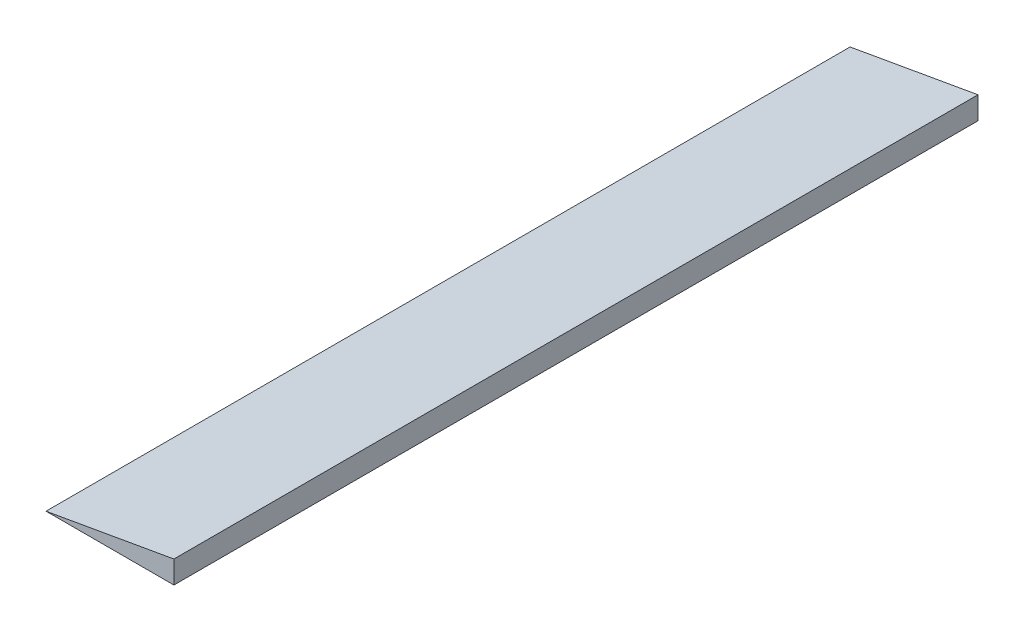
ISO-10303-21;
HEADER;
FILE_DESCRIPTION(('STEP AP214'),'2;1');
FILE_NAME('part.step','',(''),(''),'','','');
FILE_SCHEMA(('AUTOMOTIVE_DESIGN { 1 0 10303 214 1 1 1 1 }'));
ENDSEC;
DATA;
#1=APPLICATION_CONTEXT('core data for automotive mechanical design processes');
#2=APPLICATION_PROTOCOL_DEFINITION('international standard','automotive_design',2000,#1);
#3=PRODUCT_CONTEXT('',#1,'mechanical');
#4=PRODUCT('Part','Part','',(#3));
#5=PRODUCT_RELATED_PRODUCT_CATEGORY('part','',(#4));
#6=PRODUCT_DEFINITION_FORMATION('','',#4);
#7=PRODUCT_DEFINITION_CONTEXT('part definition',#1,'design');
#8=PRODUCT_DEFINITION('design','',#6,#7);
#9=PRODUCT_DEFINITION_SHAPE('','',#8);
#10=(LENGTH_UNIT() NAMED_UNIT(*) SI_UNIT(.MILLI.,.METRE.));
#11=(NAMED_UNIT(*) PLANE_ANGLE_UNIT() SI_UNIT($,.RADIAN.));
#12=(NAMED_UNIT(*) SI_UNIT($,.STERADIAN.) SOLID_ANGLE_UNIT());
#13=UNCERTAINTY_MEASURE_WITH_UNIT(LENGTH_MEASURE(1.E-05),#10,'distance_accuracy_value','');
#14=(GEOMETRIC_REPRESENTATION_CONTEXT(3) GLOBAL_UNCERTAINTY_ASSIGNED_CONTEXT((#13)) GLOBAL_UNIT_ASSIGNED_CONTEXT((#10,
#11,#12)) REPRESENTATION_CONTEXT('',''));
#15=CARTESIAN_POINT('',(0.,0.,0.));
#16=DIRECTION('',(0.,0.,1.));
#17=DIRECTION('',(1.,0.,0.));
#18=AXIS2_PLACEMENT_3D('',#15,#16,#17);
#19=CARTESIAN_POINT('',(88.9,15.6754685849819,279.4));
#20=DIRECTION('',(0.173648177666924,-0.984807753012209,0.));
#21=DIRECTION('',(0.984807753012209,0.173648177666924,0.));
#22=AXIS2_PLACEMENT_3D('',#19,#20,#21);
#23=PLANE('',#22);
#24=DIRECTION('',(-0.984807753012209,-0.173648177666924,0.));
#25=VECTOR('',#24,1.);
#26=CARTESIAN_POINT('',(88.9,15.6754685849819,-279.4));
#27=LINE('',#26,#25);
#28=CARTESIAN_POINT('',(88.9,15.6754685849819,-279.4));
#29=VERTEX_POINT('',#28);
#30=CARTESIAN_POINT('',(0.,0.,-279.4));
#31=VERTEX_POINT('',#30);
#32=EDGE_CURVE('E84',#29,#31,#27,.T.);
#33=ORIENTED_EDGE('',*,*,#32,.T.);
#34=DIRECTION('',(0.,0.,-1.));
#35=VECTOR('',#34,1.);
#36=CARTESIAN_POINT('',(0.,0.,279.4));
#37=LINE('',#36,#35);
#38=CARTESIAN_POINT('',(0.,0.,279.4));
#39=VERTEX_POINT('',#38);
#40=EDGE_CURVE('E11',#39,#31,#37,.T.);
#41=ORIENTED_EDGE('',*,*,#40,.F.);
#42=DIRECTION('',(-0.984807753012209,-0.173648177666924,0.));
#43=VECTOR('',#42,1.);
#44=CARTESIAN_POINT('',(88.9,15.6754685849819,279.4));
#45=LINE('',#44,#43);
#46=CARTESIAN_POINT('',(88.9,15.6754685849819,279.4));
#47=VERTEX_POINT('',#46);
#48=EDGE_CURVE('E76',#47,#39,#45,.T.);
#49=ORIENTED_EDGE('',*,*,#48,.F.);
#50=DIRECTION('',(0.,0.,-1.));
#51=VECTOR('',#50,1.);
#52=CARTESIAN_POINT('',(88.9,15.6754685849819,279.4));
#53=LINE('',#52,#51);
#54=EDGE_CURVE('E85',#47,#29,#53,.T.);
#55=ORIENTED_EDGE('',*,*,#54,.T.);
#56=EDGE_LOOP('',(#33,#41,#49,#55));
#57=FACE_BOUND('',#56,.T.);
#58=ADVANCED_FACE('F34',(#57),#23,.F.);
#59=CARTESIAN_POINT('',(0.,0.,279.4));
#60=DIRECTION('',(0.,1.,0.));
#61=DIRECTION('',(0.,0.,1.));
#62=AXIS2_PLACEMENT_3D('',#59,#60,#61);
#63=PLANE('',#62);
#64=DIRECTION('',(1.,0.,0.));
#65=VECTOR('',#64,1.);
#66=CARTESIAN_POINT('',(0.,0.,-279.4));
#67=LINE('',#66,#65);
#68=CARTESIAN_POINT('',(88.9,0.,-279.4));
#69=VERTEX_POINT('',#68);
#70=EDGE_CURVE('E63',#31,#69,#67,.T.);
#71=ORIENTED_EDGE('',*,*,#70,.T.);
#72=DIRECTION('',(0.,0.,-1.));
#73=VECTOR('',#72,1.);
#74=CARTESIAN_POINT('',(88.9,0.,279.4));
#75=LINE('',#74,#73);
#76=CARTESIAN_POINT('',(88.9,0.,279.4));
#77=VERTEX_POINT('',#76);
#78=EDGE_CURVE('E43',#77,#69,#75,.T.);
#79=ORIENTED_EDGE('',*,*,#78,.F.);
#80=DIRECTION('',(1.,0.,0.));
#81=VECTOR('',#80,1.);
#82=CARTESIAN_POINT('',(0.,0.,279.4));
#83=LINE('',#82,#81);
#84=EDGE_CURVE('E71',#39,#77,#83,.T.);
#85=ORIENTED_EDGE('',*,*,#84,.F.);
#86=ORIENTED_EDGE('',*,*,#40,.T.);
#87=EDGE_LOOP('',(#71,#79,#85,#86));
#88=FACE_BOUND('',#87,.T.);
#89=ADVANCED_FACE('F72',(#88),#63,.F.);
#90=CARTESIAN_POINT('',(88.9,0.,279.4));
#91=DIRECTION('',(-1.,0.,0.));
#92=DIRECTION('',(0.,0.,1.));
#93=AXIS2_PLACEMENT_3D('',#90,#91,#92);
#94=PLANE('',#93);
#95=DIRECTION('',(0.,1.,0.));
#96=VECTOR('',#95,1.);
#97=CARTESIAN_POINT('',(88.9,0.,-279.4));
#98=LINE('',#97,#96);
#99=EDGE_CURVE('E68',#69,#29,#98,.T.);
#100=ORIENTED_EDGE('',*,*,#99,.T.);
#101=ORIENTED_EDGE('',*,*,#54,.F.);
#102=DIRECTION('',(0.,1.,0.));
#103=VECTOR('',#102,1.);
#104=CARTESIAN_POINT('',(88.9,0.,279.4));
#105=LINE('',#104,#103);
#106=EDGE_CURVE('E51',#77,#47,#105,.T.);
#107=ORIENTED_EDGE('',*,*,#106,.F.);
#108=ORIENTED_EDGE('',*,*,#78,.T.);
#109=EDGE_LOOP('',(#100,#101,#107,#108));
#110=FACE_BOUND('',#109,.T.);
#111=ADVANCED_FACE('F100',(#110),#94,.F.);
#112=CARTESIAN_POINT('',(0.,0.,279.4));
#113=DIRECTION('',(0.,0.,-1.));
#114=DIRECTION('',(-1.,0.,0.));
#115=AXIS2_PLACEMENT_3D('',#112,#113,#114);
#116=PLANE('',#115);
#117=ORIENTED_EDGE('',*,*,#48,.T.);
#118=ORIENTED_EDGE('',*,*,#84,.T.);
#119=ORIENTED_EDGE('',*,*,#106,.T.);
#120=EDGE_LOOP('',(#117,#118,#119));
#121=FACE_BOUND('',#120,.T.);
#122=ADVANCED_FACE('F79',(#121),#116,.F.);
#123=CARTESIAN_POINT('',(0.,0.,-279.4));
#124=DIRECTION('',(0.,0.,-1.));
#125=DIRECTION('',(-1.,0.,0.));
#126=AXIS2_PLACEMENT_3D('',#123,#124,#125);
#127=PLANE('',#126);
#128=ORIENTED_EDGE('',*,*,#32,.F.);
#129=ORIENTED_EDGE('',*,*,#99,.F.);
#130=ORIENTED_EDGE('',*,*,#70,.F.);
#131=EDGE_LOOP('',(#128,#129,#130));
#132=FACE_BOUND('',#131,.T.);
#133=ADVANCED_FACE('F101',(#132),#127,.T.);
#134=CLOSED_SHELL('',(#58,#89,#111,#122,#133));
#135=MANIFOLD_SOLID_BREP('B2',#134);
#136=ADVANCED_BREP_SHAPE_REPRESENTATION('',(#18,#135),#14);
#137=SHAPE_DEFINITION_REPRESENTATION(#9,#136);
ENDSEC;
END-ISO-10303-21;
